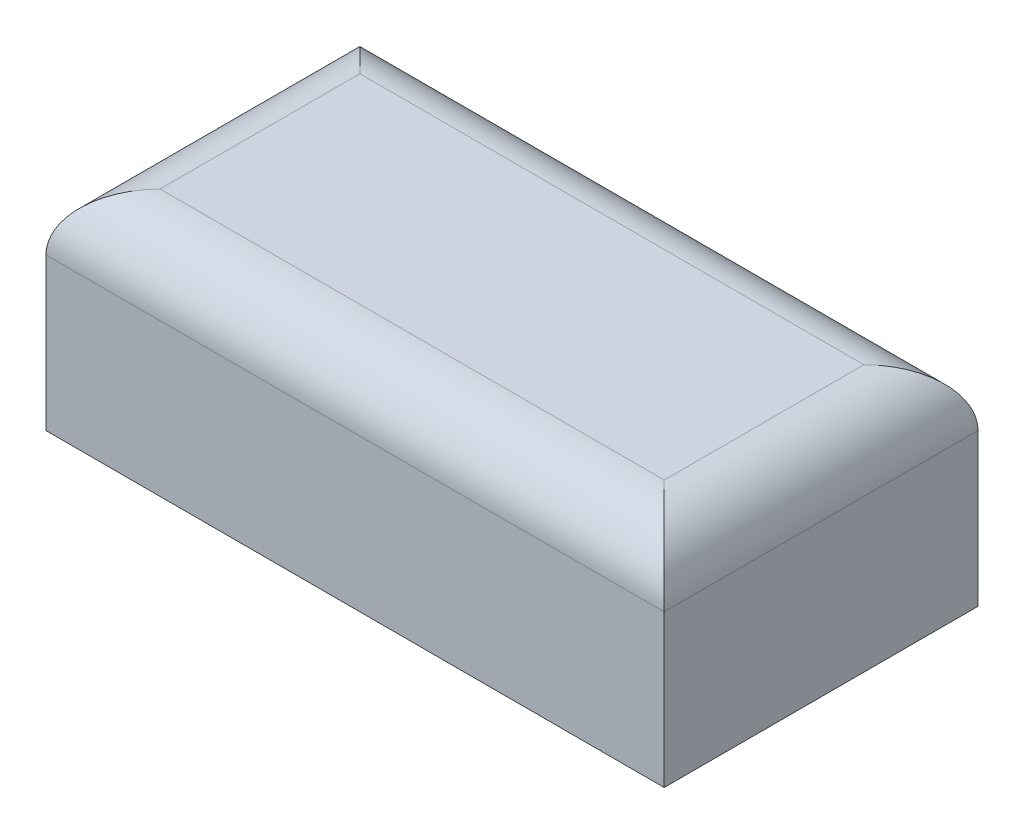
ISO-10303-21;
HEADER;
FILE_DESCRIPTION(('STEP AP214'),'2;1');
FILE_NAME('part.step','',(''),(''),'','','');
FILE_SCHEMA(('AUTOMOTIVE_DESIGN { 1 0 10303 214 1 1 1 1 }'));
ENDSEC;
DATA;
#1=APPLICATION_CONTEXT('core data for automotive mechanical design processes');
#2=APPLICATION_PROTOCOL_DEFINITION('international standard','automotive_design',2000,#1);
#3=PRODUCT_CONTEXT('',#1,'mechanical');
#4=PRODUCT('Part','Part','',(#3));
#5=PRODUCT_RELATED_PRODUCT_CATEGORY('part','',(#4));
#6=PRODUCT_DEFINITION_FORMATION('','',#4);
#7=PRODUCT_DEFINITION_CONTEXT('part definition',#1,'design');
#8=PRODUCT_DEFINITION('design','',#6,#7);
#9=PRODUCT_DEFINITION_SHAPE('','',#8);
#10=(LENGTH_UNIT() NAMED_UNIT(*) SI_UNIT(.MILLI.,.METRE.));
#11=(NAMED_UNIT(*) PLANE_ANGLE_UNIT() SI_UNIT($,.RADIAN.));
#12=(NAMED_UNIT(*) SI_UNIT($,.STERADIAN.) SOLID_ANGLE_UNIT());
#13=UNCERTAINTY_MEASURE_WITH_UNIT(LENGTH_MEASURE(1.E-05),#10,'distance_accuracy_value','');
#14=(GEOMETRIC_REPRESENTATION_CONTEXT(3) GLOBAL_UNCERTAINTY_ASSIGNED_CONTEXT((#13)) GLOBAL_UNIT_ASSIGNED_CONTEXT((#10,
#11,#12)) REPRESENTATION_CONTEXT('',''));
#15=CARTESIAN_POINT('',(0.,0.,0.));
#16=DIRECTION('',(0.,0.,1.));
#17=DIRECTION('',(1.,0.,0.));
#18=AXIS2_PLACEMENT_3D('',#15,#16,#17);
#19=CARTESIAN_POINT('',(16.25,11.,8.25));
#20=DIRECTION('',(-1.,0.,0.));
#21=DIRECTION('',(0.,0.,1.));
#22=AXIS2_PLACEMENT_3D('',#19,#20,#21);
#23=PLANE('',#22);
#24=DIRECTION('',(0.,-1.,0.));
#25=VECTOR('',#24,1.);
#26=CARTESIAN_POINT('',(16.25,11.,-8.25));
#27=LINE('',#26,#25);
#28=CARTESIAN_POINT('',(16.25,8.,-8.25));
#29=VERTEX_POINT('',#28);
#30=CARTESIAN_POINT('',(16.25,0.,-8.25));
#31=VERTEX_POINT('',#30);
#32=EDGE_CURVE('E95',#29,#31,#27,.T.);
#33=ORIENTED_EDGE('',*,*,#32,.F.);
#34=DIRECTION('',(0.,0.,-1.));
#35=VECTOR('',#34,1.);
#36=CARTESIAN_POINT('',(16.25,8.,8.25));
#37=LINE('',#36,#35);
#38=CARTESIAN_POINT('',(16.25,8.,8.25));
#39=VERTEX_POINT('',#38);
#40=EDGE_CURVE('E11',#29,#39,#37,.F.);
#41=ORIENTED_EDGE('',*,*,#40,.T.);
#42=DIRECTION('',(0.,-1.,0.));
#43=VECTOR('',#42,1.);
#44=CARTESIAN_POINT('',(16.25,11.,8.25));
#45=LINE('',#44,#43);
#46=CARTESIAN_POINT('',(16.25,0.,8.25));
#47=VERTEX_POINT('',#46);
#48=EDGE_CURVE('E115',#39,#47,#45,.T.);
#49=ORIENTED_EDGE('',*,*,#48,.T.);
#50=DIRECTION('',(0.,0.,-1.));
#51=VECTOR('',#50,1.);
#52=CARTESIAN_POINT('',(16.25,0.,8.25));
#53=LINE('',#52,#51);
#54=EDGE_CURVE('E110',#47,#31,#53,.T.);
#55=ORIENTED_EDGE('',*,*,#54,.T.);
#56=EDGE_LOOP('',(#33,#41,#49,#55));
#57=FACE_BOUND('',#56,.T.);
#58=ADVANCED_FACE('F43',(#57),#23,.F.);
#59=CARTESIAN_POINT('',(-16.25,11.,-8.25));
#60=DIRECTION('',(0.,0.,1.));
#61=DIRECTION('',(1.,0.,0.));
#62=AXIS2_PLACEMENT_3D('',#59,#60,#61);
#63=PLANE('',#62);
#64=DIRECTION('',(0.,-1.,0.));
#65=VECTOR('',#64,1.);
#66=CARTESIAN_POINT('',(-16.25,11.,-8.25));
#67=LINE('',#66,#65);
#68=CARTESIAN_POINT('',(-16.25,8.,-8.25));
#69=VERTEX_POINT('',#68);
#70=CARTESIAN_POINT('',(-16.25,0.,-8.25));
#71=VERTEX_POINT('',#70);
#72=EDGE_CURVE('E104',#69,#71,#67,.T.);
#73=ORIENTED_EDGE('',*,*,#72,.F.);
#74=DIRECTION('',(-1.,0.,0.));
#75=VECTOR('',#74,1.);
#76=CARTESIAN_POINT('',(-16.25,8.,-8.25));
#77=LINE('',#76,#75);
#78=EDGE_CURVE('E52',#69,#29,#77,.F.);
#79=ORIENTED_EDGE('',*,*,#78,.T.);
#80=ORIENTED_EDGE('',*,*,#32,.T.);
#81=DIRECTION('',(-1.,0.,0.));
#82=VECTOR('',#81,1.);
#83=CARTESIAN_POINT('',(-16.25,0.,-8.25));
#84=LINE('',#83,#82);
#85=EDGE_CURVE('E98',#31,#71,#84,.T.);
#86=ORIENTED_EDGE('',*,*,#85,.T.);
#87=EDGE_LOOP('',(#73,#79,#80,#86));
#88=FACE_BOUND('',#87,.T.);
#89=ADVANCED_FACE('F97',(#88),#63,.F.);
#90=CARTESIAN_POINT('',(-16.25,11.,8.25));
#91=DIRECTION('',(1.,0.,0.));
#92=DIRECTION('',(0.,0.,-1.));
#93=AXIS2_PLACEMENT_3D('',#90,#91,#92);
#94=PLANE('',#93);
#95=DIRECTION('',(0.,-1.,0.));
#96=VECTOR('',#95,1.);
#97=CARTESIAN_POINT('',(-16.25,11.,8.25));
#98=LINE('',#97,#96);
#99=CARTESIAN_POINT('',(-16.25,8.,8.25));
#100=VERTEX_POINT('',#99);
#101=CARTESIAN_POINT('',(-16.25,0.,8.25));
#102=VERTEX_POINT('',#101);
#103=EDGE_CURVE('E128',#100,#102,#98,.T.);
#104=ORIENTED_EDGE('',*,*,#103,.F.);
#105=DIRECTION('',(0.,0.,1.));
#106=VECTOR('',#105,1.);
#107=CARTESIAN_POINT('',(-16.25,8.,8.25));
#108=LINE('',#107,#106);
#109=EDGE_CURVE('E67',#100,#69,#108,.F.);
#110=ORIENTED_EDGE('',*,*,#109,.T.);
#111=ORIENTED_EDGE('',*,*,#72,.T.);
#112=DIRECTION('',(0.,0.,1.));
#113=VECTOR('',#112,1.);
#114=CARTESIAN_POINT('',(-16.25,0.,8.25));
#115=LINE('',#114,#113);
#116=EDGE_CURVE('E112',#71,#102,#115,.T.);
#117=ORIENTED_EDGE('',*,*,#116,.T.);
#118=EDGE_LOOP('',(#104,#110,#111,#117));
#119=FACE_BOUND('',#118,.T.);
#120=ADVANCED_FACE('F191',(#119),#94,.F.);
#121=CARTESIAN_POINT('',(-16.25,11.,8.25));
#122=DIRECTION('',(0.,0.,-1.));
#123=DIRECTION('',(-1.,0.,0.));
#124=AXIS2_PLACEMENT_3D('',#121,#122,#123);
#125=PLANE('',#124);
#126=ORIENTED_EDGE('',*,*,#48,.F.);
#127=DIRECTION('',(1.,0.,0.));
#128=VECTOR('',#127,1.);
#129=CARTESIAN_POINT('',(-16.25,8.,8.25));
#130=LINE('',#129,#128);
#131=EDGE_CURVE('E139',#39,#100,#130,.F.);
#132=ORIENTED_EDGE('',*,*,#131,.T.);
#133=ORIENTED_EDGE('',*,*,#103,.T.);
#134=DIRECTION('',(1.,0.,0.));
#135=VECTOR('',#134,1.);
#136=CARTESIAN_POINT('',(-16.25,0.,8.25));
#137=LINE('',#136,#135);
#138=EDGE_CURVE('E125',#102,#47,#137,.T.);
#139=ORIENTED_EDGE('',*,*,#138,.T.);
#140=EDGE_LOOP('',(#126,#132,#133,#139));
#141=FACE_BOUND('',#140,.T.);
#142=ADVANCED_FACE('F217',(#141),#125,.F.);
#143=CARTESIAN_POINT('',(0.,11.,0.));
#144=DIRECTION('',(0.,-1.,0.));
#145=DIRECTION('',(0.,0.,-1.));
#146=AXIS2_PLACEMENT_3D('',#143,#144,#145);
#147=PLANE('',#146);
#148=DIRECTION('',(0.,0.,1.));
#149=VECTOR('',#148,1.);
#150=CARTESIAN_POINT('',(-13.25,11.,0.));
#151=LINE('',#150,#149);
#152=CARTESIAN_POINT('',(-13.25,11.,-5.25));
#153=VERTEX_POINT('',#152);
#154=CARTESIAN_POINT('',(-13.25,11.,5.25));
#155=VERTEX_POINT('',#154);
#156=EDGE_CURVE('E134',#153,#155,#151,.T.);
#157=ORIENTED_EDGE('',*,*,#156,.T.);
#158=DIRECTION('',(1.,0.,0.));
#159=VECTOR('',#158,1.);
#160=CARTESIAN_POINT('',(0.,11.,5.25));
#161=LINE('',#160,#159);
#162=CARTESIAN_POINT('',(13.25,11.,5.25));
#163=VERTEX_POINT('',#162);
#164=EDGE_CURVE('E136',#155,#163,#161,.T.);
#165=ORIENTED_EDGE('',*,*,#164,.T.);
#166=DIRECTION('',(0.,0.,-1.));
#167=VECTOR('',#166,1.);
#168=CARTESIAN_POINT('',(13.25,11.,0.));
#169=LINE('',#168,#167);
#170=CARTESIAN_POINT('',(13.25,11.,-5.25));
#171=VERTEX_POINT('',#170);
#172=EDGE_CURVE('E103',#163,#171,#169,.T.);
#173=ORIENTED_EDGE('',*,*,#172,.T.);
#174=DIRECTION('',(-1.,0.,0.));
#175=VECTOR('',#174,1.);
#176=CARTESIAN_POINT('',(0.,11.,-5.25));
#177=LINE('',#176,#175);
#178=EDGE_CURVE('E132',#171,#153,#177,.T.);
#179=ORIENTED_EDGE('',*,*,#178,.T.);
#180=EDGE_LOOP('',(#157,#165,#173,#179));
#181=FACE_BOUND('',#180,.T.);
#182=ADVANCED_FACE('F221',(#181),#147,.F.);
#183=CARTESIAN_POINT('',(0.,0.,0.));
#184=DIRECTION('',(0.,-1.,0.));
#185=DIRECTION('',(0.,0.,-1.));
#186=AXIS2_PLACEMENT_3D('',#183,#184,#185);
#187=PLANE('',#186);
#188=CARTESIAN_POINT('',(0.,0.,0.));
#189=DIRECTION('',(0.,1.,0.));
#190=DIRECTION('',(0.,0.,1.));
#191=AXIS2_PLACEMENT_3D('',#188,#189,#190);
#192=CIRCLE('',#191,6.7);
#193=CARTESIAN_POINT('',(0.,0.,6.7));
#194=VERTEX_POINT('',#193);
#195=EDGE_CURVE('E120',#194,#194,#192,.T.);
#196=ORIENTED_EDGE('',*,*,#195,.T.);
#197=EDGE_LOOP('',(#196));
#198=FACE_BOUND('',#197,.T.);
#199=ORIENTED_EDGE('',*,*,#54,.F.);
#200=ORIENTED_EDGE('',*,*,#138,.F.);
#201=ORIENTED_EDGE('',*,*,#116,.F.);
#202=ORIENTED_EDGE('',*,*,#85,.F.);
#203=EDGE_LOOP('',(#199,#200,#201,#202));
#204=FACE_BOUND('',#203,.T.);
#205=ADVANCED_FACE('F108',(#198,#204),#187,.T.);
#206=CARTESIAN_POINT('',(0.,1.3,0.));
#207=DIRECTION('',(0.,1.,0.));
#208=DIRECTION('',(0.,0.,1.));
#209=AXIS2_PLACEMENT_3D('',#206,#207,#208);
#210=PLANE('',#209);
#211=CARTESIAN_POINT('',(0.,1.3,0.));
#212=DIRECTION('',(0.,1.,0.));
#213=DIRECTION('',(0.,0.,1.));
#214=AXIS2_PLACEMENT_3D('',#211,#212,#213);
#215=CIRCLE('',#214,6.7);
#216=CARTESIAN_POINT('',(0.,1.3,6.7));
#217=VERTEX_POINT('',#216);
#218=EDGE_CURVE('E117',#217,#217,#215,.T.);
#219=ORIENTED_EDGE('',*,*,#218,.F.);
#220=EDGE_LOOP('',(#219));
#221=FACE_BOUND('',#220,.T.);
#222=CARTESIAN_POINT('',(0.,1.3,0.));
#223=DIRECTION('',(0.,1.,0.));
#224=DIRECTION('',(0.,0.,1.));
#225=AXIS2_PLACEMENT_3D('',#222,#223,#224);
#226=CIRCLE('',#225,6.055);
#227=CARTESIAN_POINT('',(0.,1.3,6.055));
#228=VERTEX_POINT('',#227);
#229=EDGE_CURVE('E158',#228,#228,#226,.T.);
#230=ORIENTED_EDGE('',*,*,#229,.T.);
#231=EDGE_LOOP('',(#230));
#232=FACE_BOUND('',#231,.T.);
#233=ADVANCED_FACE('F173',(#221,#232),#210,.F.);
#234=CARTESIAN_POINT('',(0.,1.3,0.));
#235=DIRECTION('',(0.,-1.,0.));
#236=DIRECTION('',(0.,0.,-1.));
#237=AXIS2_PLACEMENT_3D('',#234,#235,#236);
#238=CYLINDRICAL_SURFACE('',#237,6.7);
#239=ORIENTED_EDGE('',*,*,#218,.T.);
#240=EDGE_LOOP('',(#239));
#241=FACE_BOUND('',#240,.T.);
#242=ORIENTED_EDGE('',*,*,#195,.F.);
#243=EDGE_LOOP('',(#242));
#244=FACE_BOUND('',#243,.T.);
#245=ADVANCED_FACE('F170',(#241,#244),#238,.F.);
#246=CARTESIAN_POINT('',(0.,5.6,0.));
#247=DIRECTION('',(0.,-1.,0.));
#248=DIRECTION('',(0.,0.,-1.));
#249=AXIS2_PLACEMENT_3D('',#246,#247,#248);
#250=CYLINDRICAL_SURFACE('',#249,6.055);
#251=ORIENTED_EDGE('',*,*,#229,.F.);
#252=EDGE_LOOP('',(#251));
#253=FACE_BOUND('',#252,.T.);
#254=CARTESIAN_POINT('',(0.,5.6,0.));
#255=DIRECTION('',(0.,1.,0.));
#256=DIRECTION('',(0.,0.,1.));
#257=AXIS2_PLACEMENT_3D('',#254,#255,#256);
#258=CIRCLE('',#257,6.055);
#259=CARTESIAN_POINT('',(0.,5.6,6.055));
#260=VERTEX_POINT('',#259);
#261=EDGE_CURVE('E153',#260,#260,#258,.T.);
#262=ORIENTED_EDGE('',*,*,#261,.T.);
#263=EDGE_LOOP('',(#262));
#264=FACE_BOUND('',#263,.T.);
#265=ADVANCED_FACE('F172',(#253,#264),#250,.F.);
#266=CARTESIAN_POINT('',(0.,5.6,0.));
#267=DIRECTION('',(0.,1.,0.));
#268=DIRECTION('',(0.,0.,1.));
#269=AXIS2_PLACEMENT_3D('',#266,#267,#268);
#270=PLANE('',#269);
#271=ORIENTED_EDGE('',*,*,#261,.F.);
#272=EDGE_LOOP('',(#271));
#273=FACE_BOUND('',#272,.T.);
#274=ADVANCED_FACE('F179',(#273),#270,.F.);
#275=CARTESIAN_POINT('',(0.,8.,-5.25));
#276=DIRECTION('',(-1.,0.,0.));
#277=DIRECTION('',(0.,0.,1.));
#278=AXIS2_PLACEMENT_3D('',#275,#276,#277);
#279=CYLINDRICAL_SURFACE('',#278,3.);
#280=CARTESIAN_POINT('',(13.25,8.,-5.25));
#281=DIRECTION('',(-0.707106781186547,0.,-0.707106781186547));
#282=DIRECTION('',(0.707106781186547,0.,-0.707106781186547));
#283=AXIS2_PLACEMENT_3D('',#280,#281,#282);
#284=ELLIPSE('',#283,4.24264068711928,3.);
#285=EDGE_CURVE('E147',#29,#171,#284,.F.);
#286=ORIENTED_EDGE('',*,*,#285,.F.);
#287=ORIENTED_EDGE('',*,*,#78,.F.);
#288=CARTESIAN_POINT('',(-13.25,8.,-5.25));
#289=DIRECTION('',(-0.707106781186547,0.,0.707106781186547));
#290=DIRECTION('',(-0.707106781186547,0.,-0.707106781186547));
#291=AXIS2_PLACEMENT_3D('',#288,#289,#290);
#292=ELLIPSE('',#291,4.24264068711928,3.);
#293=EDGE_CURVE('E47',#153,#69,#292,.T.);
#294=ORIENTED_EDGE('',*,*,#293,.F.);
#295=ORIENTED_EDGE('',*,*,#178,.F.);
#296=EDGE_LOOP('',(#286,#287,#294,#295));
#297=FACE_BOUND('',#296,.T.);
#298=ADVANCED_FACE('F45',(#297),#279,.T.);
#299=CARTESIAN_POINT('',(-13.25,8.,0.));
#300=DIRECTION('',(0.,0.,1.));
#301=DIRECTION('',(1.,0.,0.));
#302=AXIS2_PLACEMENT_3D('',#299,#300,#301);
#303=CYLINDRICAL_SURFACE('',#302,3.);
#304=ORIENTED_EDGE('',*,*,#293,.T.);
#305=ORIENTED_EDGE('',*,*,#109,.F.);
#306=CARTESIAN_POINT('',(-13.25,8.,5.25));
#307=DIRECTION('',(0.707106781186547,0.,0.707106781186547));
#308=DIRECTION('',(-0.707106781186547,0.,0.707106781186547));
#309=AXIS2_PLACEMENT_3D('',#306,#307,#308);
#310=ELLIPSE('',#309,4.24264068711928,3.);
#311=EDGE_CURVE('E146',#155,#100,#310,.T.);
#312=ORIENTED_EDGE('',*,*,#311,.F.);
#313=ORIENTED_EDGE('',*,*,#156,.F.);
#314=EDGE_LOOP('',(#304,#305,#312,#313));
#315=FACE_BOUND('',#314,.T.);
#316=ADVANCED_FACE('F201',(#315),#303,.T.);
#317=CARTESIAN_POINT('',(13.25,8.,0.));
#318=DIRECTION('',(0.,0.,-1.));
#319=DIRECTION('',(-1.,0.,0.));
#320=AXIS2_PLACEMENT_3D('',#317,#318,#319);
#321=CYLINDRICAL_SURFACE('',#320,3.);
#322=ORIENTED_EDGE('',*,*,#285,.T.);
#323=ORIENTED_EDGE('',*,*,#172,.F.);
#324=CARTESIAN_POINT('',(13.25,8.,5.25));
#325=DIRECTION('',(0.707106781186547,0.,-0.707106781186547));
#326=DIRECTION('',(-0.707106781186547,0.,-0.707106781186547));
#327=AXIS2_PLACEMENT_3D('',#324,#325,#326);
#328=ELLIPSE('',#327,4.24264068711928,3.);
#329=EDGE_CURVE('E144',#39,#163,#328,.F.);
#330=ORIENTED_EDGE('',*,*,#329,.F.);
#331=ORIENTED_EDGE('',*,*,#40,.F.);
#332=EDGE_LOOP('',(#322,#323,#330,#331));
#333=FACE_BOUND('',#332,.T.);
#334=ADVANCED_FACE('F198',(#333),#321,.T.);
#335=CARTESIAN_POINT('',(0.,8.,5.25));
#336=DIRECTION('',(1.,0.,0.));
#337=DIRECTION('',(0.,0.,-1.));
#338=AXIS2_PLACEMENT_3D('',#335,#336,#337);
#339=CYLINDRICAL_SURFACE('',#338,3.);
#340=ORIENTED_EDGE('',*,*,#311,.T.);
#341=ORIENTED_EDGE('',*,*,#131,.F.);
#342=ORIENTED_EDGE('',*,*,#329,.T.);
#343=ORIENTED_EDGE('',*,*,#164,.F.);
#344=EDGE_LOOP('',(#340,#341,#342,#343));
#345=FACE_BOUND('',#344,.T.);
#346=ADVANCED_FACE('F195',(#345),#339,.T.);
#347=CLOSED_SHELL('',(#58,#89,#120,#142,#182,#205,#233,#245,#265,#274,#298,#316,#334,#346));
#348=MANIFOLD_SOLID_BREP('B2',#347);
#349=ADVANCED_BREP_SHAPE_REPRESENTATION('',(#18,#348),#14);
#350=SHAPE_DEFINITION_REPRESENTATION(#9,#349);
ENDSEC;
END-ISO-10303-21;
